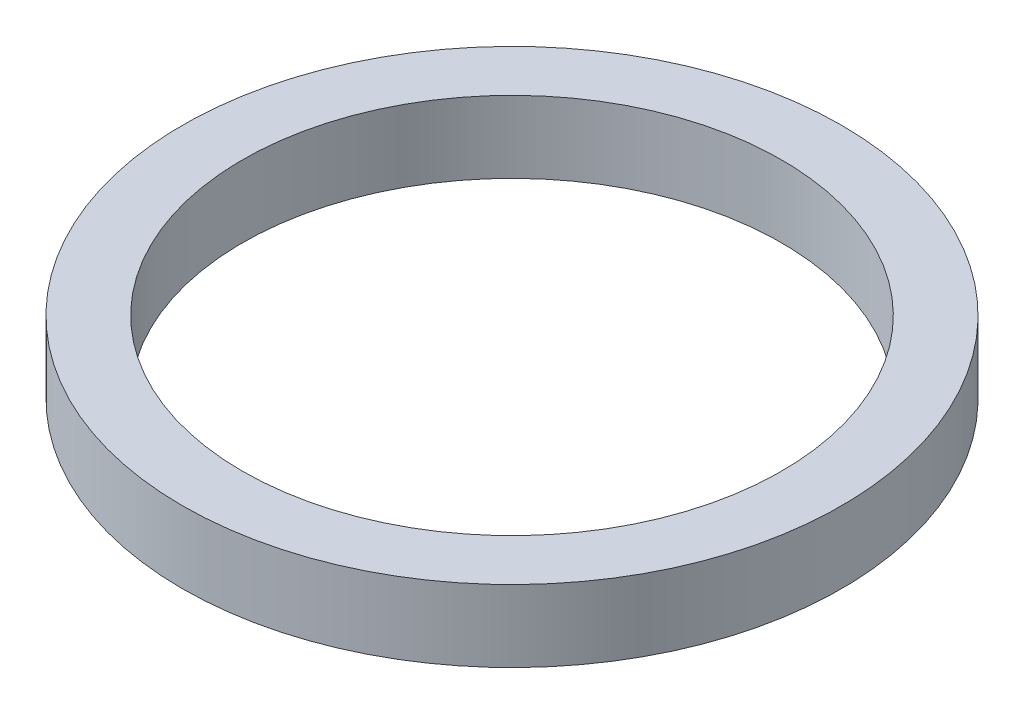
ISO-10303-21;
HEADER;
FILE_DESCRIPTION(('STEP AP214'),'2;1');
FILE_NAME('part.step','',(''),(''),'','','');
FILE_SCHEMA(('AUTOMOTIVE_DESIGN { 1 0 10303 214 1 1 1 1 }'));
ENDSEC;
DATA;
#1=APPLICATION_CONTEXT('core data for automotive mechanical design processes');
#2=APPLICATION_PROTOCOL_DEFINITION('international standard','automotive_design',2000,#1);
#3=PRODUCT_CONTEXT('',#1,'mechanical');
#4=PRODUCT('Part','Part','',(#3));
#5=PRODUCT_RELATED_PRODUCT_CATEGORY('part','',(#4));
#6=PRODUCT_DEFINITION_FORMATION('','',#4);
#7=PRODUCT_DEFINITION_CONTEXT('part definition',#1,'design');
#8=PRODUCT_DEFINITION('design','',#6,#7);
#9=PRODUCT_DEFINITION_SHAPE('','',#8);
#10=(LENGTH_UNIT() NAMED_UNIT(*) SI_UNIT(.MILLI.,.METRE.));
#11=(NAMED_UNIT(*) PLANE_ANGLE_UNIT() SI_UNIT($,.RADIAN.));
#12=(NAMED_UNIT(*) SI_UNIT($,.STERADIAN.) SOLID_ANGLE_UNIT());
#13=UNCERTAINTY_MEASURE_WITH_UNIT(LENGTH_MEASURE(1.E-05),#10,'distance_accuracy_value','');
#14=(GEOMETRIC_REPRESENTATION_CONTEXT(3) GLOBAL_UNCERTAINTY_ASSIGNED_CONTEXT((#13)) GLOBAL_UNIT_ASSIGNED_CONTEXT((#10,
#11,#12)) REPRESENTATION_CONTEXT('',''));
#15=CARTESIAN_POINT('',(0.,0.,0.));
#16=DIRECTION('',(0.,0.,1.));
#17=DIRECTION('',(1.,0.,0.));
#18=AXIS2_PLACEMENT_3D('',#15,#16,#17);
#19=CARTESIAN_POINT('',(0.,3.,0.));
#20=DIRECTION('',(0.,1.,0.));
#21=DIRECTION('',(0.,0.,1.));
#22=AXIS2_PLACEMENT_3D('',#19,#20,#21);
#23=PLANE('',#22);
#24=CARTESIAN_POINT('',(0.,3.,0.));
#25=DIRECTION('',(0.,1.,0.));
#26=DIRECTION('',(0.,0.,1.));
#27=AXIS2_PLACEMENT_3D('',#24,#25,#26);
#28=CIRCLE('',#27,27.5);
#29=CARTESIAN_POINT('',(0.,3.,27.5));
#30=VERTEX_POINT('',#29);
#31=EDGE_CURVE('E10',#30,#30,#28,.T.);
#32=ORIENTED_EDGE('',*,*,#31,.T.);
#33=EDGE_LOOP('',(#32));
#34=FACE_BOUND('',#33,.T.);
#35=CARTESIAN_POINT('',(0.,3.,0.));
#36=DIRECTION('',(0.,1.,0.));
#37=DIRECTION('',(0.,0.,1.));
#38=AXIS2_PLACEMENT_3D('',#35,#36,#37);
#39=CIRCLE('',#38,22.5);
#40=CARTESIAN_POINT('',(0.,3.,22.5));
#41=VERTEX_POINT('',#40);
#42=EDGE_CURVE('E54',#41,#41,#39,.T.);
#43=ORIENTED_EDGE('',*,*,#42,.F.);
#44=EDGE_LOOP('',(#43));
#45=FACE_BOUND('',#44,.T.);
#46=ADVANCED_FACE('F41',(#34,#45),#23,.T.);
#47=CARTESIAN_POINT('',(0.,-3.,0.));
#48=DIRECTION('',(0.,1.,0.));
#49=DIRECTION('',(0.,0.,1.));
#50=AXIS2_PLACEMENT_3D('',#47,#48,#49);
#51=PLANE('',#50);
#52=CARTESIAN_POINT('',(0.,-3.,0.));
#53=DIRECTION('',(0.,1.,0.));
#54=DIRECTION('',(0.,0.,1.));
#55=AXIS2_PLACEMENT_3D('',#52,#53,#54);
#56=CIRCLE('',#55,27.5);
#57=CARTESIAN_POINT('',(0.,-3.,27.5));
#58=VERTEX_POINT('',#57);
#59=EDGE_CURVE('E45',#58,#58,#56,.T.);
#60=ORIENTED_EDGE('',*,*,#59,.F.);
#61=EDGE_LOOP('',(#60));
#62=FACE_BOUND('',#61,.T.);
#63=CARTESIAN_POINT('',(0.,-3.,0.));
#64=DIRECTION('',(0.,1.,0.));
#65=DIRECTION('',(0.,0.,1.));
#66=AXIS2_PLACEMENT_3D('',#63,#64,#65);
#67=CIRCLE('',#66,22.5);
#68=CARTESIAN_POINT('',(0.,-3.,22.5));
#69=VERTEX_POINT('',#68);
#70=EDGE_CURVE('E56',#69,#69,#67,.T.);
#71=ORIENTED_EDGE('',*,*,#70,.T.);
#72=EDGE_LOOP('',(#71));
#73=FACE_BOUND('',#72,.T.);
#74=ADVANCED_FACE('F68',(#62,#73),#51,.F.);
#75=CARTESIAN_POINT('',(0.,3.,0.));
#76=DIRECTION('',(0.,-1.,0.));
#77=DIRECTION('',(0.,0.,-1.));
#78=AXIS2_PLACEMENT_3D('',#75,#76,#77);
#79=CYLINDRICAL_SURFACE('',#78,27.5);
#80=ORIENTED_EDGE('',*,*,#31,.F.);
#81=EDGE_LOOP('',(#80));
#82=FACE_BOUND('',#81,.T.);
#83=ORIENTED_EDGE('',*,*,#59,.T.);
#84=EDGE_LOOP('',(#83));
#85=FACE_BOUND('',#84,.T.);
#86=ADVANCED_FACE('F43',(#82,#85),#79,.T.);
#87=CARTESIAN_POINT('',(0.,3.,0.));
#88=DIRECTION('',(0.,-1.,0.));
#89=DIRECTION('',(0.,0.,-1.));
#90=AXIS2_PLACEMENT_3D('',#87,#88,#89);
#91=CYLINDRICAL_SURFACE('',#90,22.5);
#92=ORIENTED_EDGE('',*,*,#42,.T.);
#93=EDGE_LOOP('',(#92));
#94=FACE_BOUND('',#93,.T.);
#95=ORIENTED_EDGE('',*,*,#70,.F.);
#96=EDGE_LOOP('',(#95));
#97=FACE_BOUND('',#96,.T.);
#98=ADVANCED_FACE('F64',(#94,#97),#91,.F.);
#99=CLOSED_SHELL('',(#46,#74,#86,#98));
#100=MANIFOLD_SOLID_BREP('B2',#99);
#101=ADVANCED_BREP_SHAPE_REPRESENTATION('',(#18,#100),#14);
#102=SHAPE_DEFINITION_REPRESENTATION(#9,#101);
ENDSEC;
END-ISO-10303-21;
